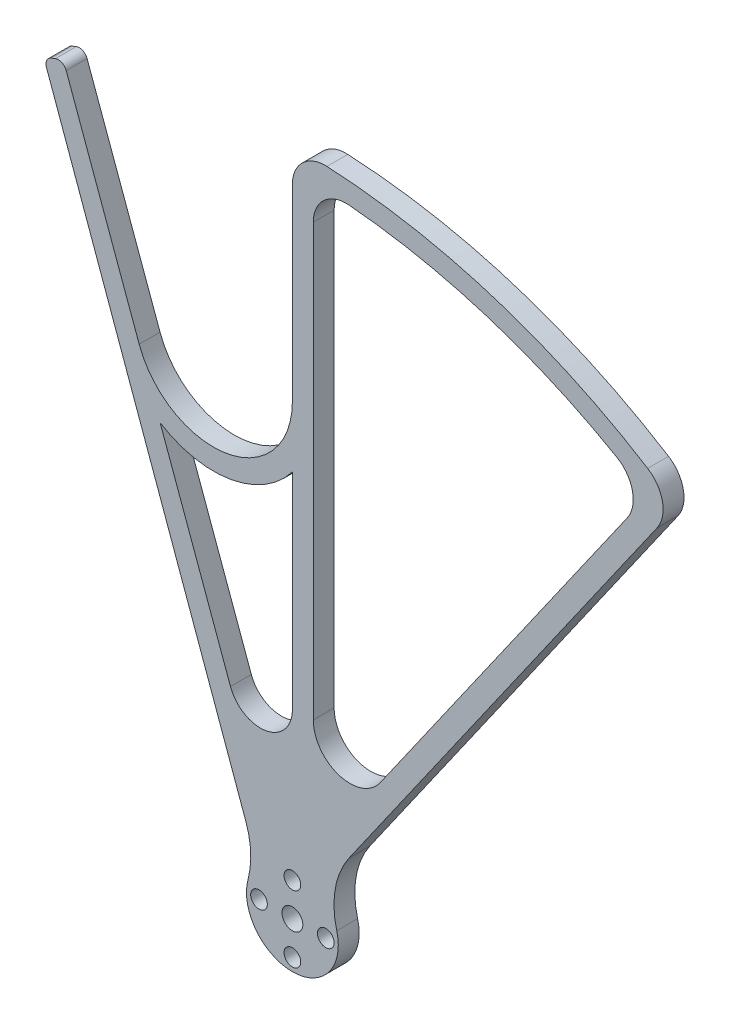
ISO-10303-21;
HEADER;
FILE_DESCRIPTION(('STEP AP214'),'2;1');
FILE_NAME('part.step','',(''),(''),'','','');
FILE_SCHEMA(('AUTOMOTIVE_DESIGN { 1 0 10303 214 1 1 1 1 }'));
ENDSEC;
DATA;
#1=APPLICATION_CONTEXT('core data for automotive mechanical design processes');
#2=APPLICATION_PROTOCOL_DEFINITION('international standard','automotive_design',2000,#1);
#3=PRODUCT_CONTEXT('',#1,'mechanical');
#4=PRODUCT('Part','Part','',(#3));
#5=PRODUCT_RELATED_PRODUCT_CATEGORY('part','',(#4));
#6=PRODUCT_DEFINITION_FORMATION('','',#4);
#7=PRODUCT_DEFINITION_CONTEXT('part definition',#1,'design');
#8=PRODUCT_DEFINITION('design','',#6,#7);
#9=PRODUCT_DEFINITION_SHAPE('','',#8);
#10=(LENGTH_UNIT() NAMED_UNIT(*) SI_UNIT(.MILLI.,.METRE.));
#11=(NAMED_UNIT(*) PLANE_ANGLE_UNIT() SI_UNIT($,.RADIAN.));
#12=(NAMED_UNIT(*) SI_UNIT($,.STERADIAN.) SOLID_ANGLE_UNIT());
#13=UNCERTAINTY_MEASURE_WITH_UNIT(LENGTH_MEASURE(1.E-05),#10,'distance_accuracy_value','');
#14=(GEOMETRIC_REPRESENTATION_CONTEXT(3) GLOBAL_UNCERTAINTY_ASSIGNED_CONTEXT((#13)) GLOBAL_UNIT_ASSIGNED_CONTEXT((#10,
#11,#12)) REPRESENTATION_CONTEXT('',''));
#15=CARTESIAN_POINT('',(0.,0.,0.));
#16=DIRECTION('',(0.,0.,1.));
#17=DIRECTION('',(1.,0.,0.));
#18=AXIS2_PLACEMENT_3D('',#15,#16,#17);
#19=CARTESIAN_POINT('',(0.,0.,6.35));
#20=DIRECTION('',(0.,0.,1.));
#21=DIRECTION('',(1.,0.,0.));
#22=AXIS2_PLACEMENT_3D('',#19,#20,#21);
#23=PLANE('',#22);
#24=CARTESIAN_POINT('',(0.,10.16,6.35));
#25=DIRECTION('',(0.,0.,1.));
#26=DIRECTION('',(1.,0.,0.));
#27=AXIS2_PLACEMENT_3D('',#24,#25,#26);
#28=CIRCLE('',#27,2.54);
#29=CARTESIAN_POINT('',(2.54,10.16,6.35));
#30=VERTEX_POINT('',#29);
#31=EDGE_CURVE('E1002',#30,#30,#28,.T.);
#32=ORIENTED_EDGE('',*,*,#31,.F.);
#33=EDGE_LOOP('',(#32));
#34=FACE_BOUND('',#33,.T.);
#35=CARTESIAN_POINT('',(10.1600000000003,2.86898206091004E-13,6.35));
#36=DIRECTION('',(0.,0.,1.));
#37=DIRECTION('',(1.,0.,0.));
#38=AXIS2_PLACEMENT_3D('',#35,#36,#37);
#39=CIRCLE('',#38,2.54000000000023);
#40=CARTESIAN_POINT('',(12.7000000000005,2.86898206091004E-13,6.35));
#41=VERTEX_POINT('',#40);
#42=EDGE_CURVE('E1025',#41,#41,#39,.T.);
#43=ORIENTED_EDGE('',*,*,#42,.F.);
#44=EDGE_LOOP('',(#43));
#45=FACE_BOUND('',#44,.T.);
#46=CARTESIAN_POINT('',(5.73796412182008E-13,-10.16,6.35));
#47=DIRECTION('',(0.,0.,1.));
#48=DIRECTION('',(1.,0.,0.));
#49=AXIS2_PLACEMENT_3D('',#46,#47,#48);
#50=CIRCLE('',#49,2.54000000000062);
#51=CARTESIAN_POINT('',(2.54000000000119,-10.16,6.35));
#52=VERTEX_POINT('',#51);
#53=EDGE_CURVE('E1017',#52,#52,#50,.T.);
#54=ORIENTED_EDGE('',*,*,#53,.F.);
#55=EDGE_LOOP('',(#54));
#56=FACE_BOUND('',#55,.T.);
#57=CARTESIAN_POINT('',(-10.1599999999997,-2.88142447238938E-13,6.35));
#58=DIRECTION('',(0.,0.,1.));
#59=DIRECTION('',(1.,0.,0.));
#60=AXIS2_PLACEMENT_3D('',#57,#58,#59);
#61=CIRCLE('',#60,2.54000000000046);
#62=CARTESIAN_POINT('',(-7.61999999999925,-2.88142447238938E-13,6.35));
#63=VERTEX_POINT('',#62);
#64=EDGE_CURVE('E1009',#63,#63,#61,.T.);
#65=ORIENTED_EDGE('',*,*,#64,.F.);
#66=EDGE_LOOP('',(#65));
#67=FACE_BOUND('',#66,.T.);
#68=CARTESIAN_POINT('',(-9.71604686105834,55.1024399216737,6.35));
#69=DIRECTION('',(0.,0.,1.));
#70=DIRECTION('',(1.,0.,0.));
#71=AXIS2_PLACEMENT_3D('',#68,#69,#70);
#72=CIRCLE('',#71,9.71604686105832);
#73=CARTESIAN_POINT('',(-18.8461443996049,51.7793561816956,6.35));
#74=VERTEX_POINT('',#73);
#75=CARTESIAN_POINT('',(0.,55.1024399216737,6.35));
#76=VERTEX_POINT('',#75);
#77=EDGE_CURVE('E316',#74,#76,#72,.T.);
#78=ORIENTED_EDGE('',*,*,#77,.F.);
#79=DIRECTION('',(0.34202014332567,-0.939692620785908,0.));
#80=VECTOR('',#79,1.);
#81=CARTESIAN_POINT('',(0.,0.,6.35));
#82=LINE('',#81,#80);
#83=CARTESIAN_POINT('',(-40.2695375819558,110.639645198303,6.35));
#84=VERTEX_POINT('',#83);
#85=EDGE_CURVE('E304',#84,#74,#82,.T.);
#86=ORIENTED_EDGE('',*,*,#85,.F.);
#87=CARTESIAN_POINT('',(-24.0388323197738,136.330992699971,6.35));
#88=DIRECTION('',(0.,0.,1.));
#89=DIRECTION('',(1.,0.,0.));
#90=AXIS2_PLACEMENT_3D('',#87,#88,#89);
#91=CIRCLE('',#90,30.3888323197738);
#92=CARTESIAN_POINT('',(0.,117.740251174655,6.35));
#93=VERTEX_POINT('',#92);
#94=EDGE_CURVE('E335',#84,#93,#91,.T.);
#95=ORIENTED_EDGE('',*,*,#94,.T.);
#96=DIRECTION('',(0.,1.,0.));
#97=VECTOR('',#96,1.);
#98=CARTESIAN_POINT('',(0.,0.,6.35));
#99=LINE('',#98,#97);
#100=EDGE_CURVE('E331',#76,#93,#99,.T.);
#101=ORIENTED_EDGE('',*,*,#100,.F.);
#102=EDGE_LOOP('',(#78,#86,#95,#101));
#103=FACE_BOUND('',#102,.T.);
#104=DIRECTION('',(-0.34202014332567,0.939692620785908,0.));
#105=VECTOR('',#104,1.);
#106=CARTESIAN_POINT('',(-46.627945662975,128.109227824581,6.35));
#107=LINE('',#106,#105);
#108=CARTESIAN_POINT('',(-46.627945662975,128.109227824581,6.35));
#109=VERTEX_POINT('',#108);
#110=CARTESIAN_POINT('',(-68.8359192444153,189.125133771432,6.35));
#111=VERTEX_POINT('',#110);
#112=EDGE_CURVE('E399',#109,#111,#107,.T.);
#113=ORIENTED_EDGE('',*,*,#112,.T.);
#114=CARTESIAN_POINT('',(-71.2227385012115,188.256402607385,6.35));
#115=DIRECTION('',(0.,0.,1.));
#116=DIRECTION('',(1.,0.,0.));
#117=AXIS2_PLACEMENT_3D('',#114,#115,#116);
#118=CIRCLE('',#117,2.54);
#119=CARTESIAN_POINT('',(-72.1215205096228,190.632069019438,6.35));
#120=VERTEX_POINT('',#119);
#121=EDGE_CURVE('E537',#111,#120,#118,.T.);
#122=ORIENTED_EDGE('',*,*,#121,.T.);
#123=CARTESIAN_POINT('',(0.,0.,6.35));
#124=DIRECTION('',(0.,0.,1.));
#125=DIRECTION('',(1.,0.,0.));
#126=AXIS2_PLACEMENT_3D('',#123,#124,#125);
#127=CIRCLE('',#126,203.818790741314);
#128=CARTESIAN_POINT('',(-73.3590902899023,190.15925781063,6.35));
#129=VERTEX_POINT('',#128);
#130=EDGE_CURVE('E403',#120,#129,#127,.T.);
#131=ORIENTED_EDGE('',*,*,#130,.T.);
#132=CARTESIAN_POINT('',(-72.4448856247748,187.789483595592,6.35));
#133=DIRECTION('',(0.,0.,1.));
#134=DIRECTION('',(1.,0.,0.));
#135=AXIS2_PLACEMENT_3D('',#132,#133,#134);
#136=CIRCLE('',#135,2.54);
#137=CARTESIAN_POINT('',(-74.8344424752258,186.928311105052,6.35));
#138=VERTEX_POINT('',#137);
#139=EDGE_CURVE('E534',#129,#138,#136,.T.);
#140=ORIENTED_EDGE('',*,*,#139,.T.);
#141=DIRECTION('',(0.339044287614181,-0.940770413563369,0.));
#142=VECTOR('',#141,1.);
#143=CARTESIAN_POINT('',(-75.6714998267329,189.250953955917,6.35));
#144=LINE('',#143,#142);
#145=CARTESIAN_POINT('',(-14.1628084371073,18.5783924343719,6.35));
#146=VERTEX_POINT('',#145);
#147=EDGE_CURVE('E408',#138,#146,#144,.T.);
#148=ORIENTED_EDGE('',*,*,#147,.T.);
#149=CARTESIAN_POINT('',(-37.9078536754467,10.02091461499,6.35));
#150=DIRECTION('',(0.,0.,1.));
#151=DIRECTION('',(1.,0.,0.));
#152=AXIS2_PLACEMENT_3D('',#149,#150,#151);
#153=CIRCLE('',#152,25.24);
#154=CARTESIAN_POINT('',(-13.5060626331546,3.57031821401198,6.35));
#155=VERTEX_POINT('',#154);
#156=EDGE_CURVE('E12',#146,#155,#153,.F.);
#157=ORIENTED_EDGE('',*,*,#156,.T.);
#158=CARTESIAN_POINT('',(0.,0.,6.35));
#159=DIRECTION('',(0.,0.,1.));
#160=DIRECTION('',(1.,0.,0.));
#161=AXIS2_PLACEMENT_3D('',#158,#159,#160);
#162=CIRCLE('',#161,13.97);
#163=CARTESIAN_POINT('',(13.4983455539887,3.59938429528074,6.35));
#164=VERTEX_POINT('',#163);
#165=EDGE_CURVE('E411',#155,#164,#162,.T.);
#166=ORIENTED_EDGE('',*,*,#165,.T.);
#167=CARTESIAN_POINT('',(37.886193927838,10.1024952196104,6.35));
#168=DIRECTION('',(0.,0.,1.));
#169=DIRECTION('',(1.,0.,0.));
#170=AXIS2_PLACEMENT_3D('',#167,#168,#169);
#171=CIRCLE('',#170,25.24);
#172=CARTESIAN_POINT('',(17.2107963299839,24.5795644731109,6.35));
#173=VERTEX_POINT('',#172);
#174=EDGE_CURVE('E560',#164,#173,#171,.F.);
#175=ORIENTED_EDGE('',*,*,#174,.T.);
#176=DIRECTION('',(0.573576436351047,0.819152044288991,0.));
#177=VECTOR('',#176,1.);
#178=CARTESIAN_POINT('',(8.01286281582413,11.4435540587172,6.35));
#179=LINE('',#178,#177);
#180=CARTESIAN_POINT('',(111.021825497871,158.555598789654,6.35));
#181=VERTEX_POINT('',#180);
#182=EDGE_CURVE('E415',#173,#181,#179,.T.);
#183=ORIENTED_EDGE('',*,*,#182,.T.);
#184=CARTESIAN_POINT('',(102.830305054981,164.291363153165,6.35));
#185=DIRECTION('',(0.,0.,1.));
#186=DIRECTION('',(1.,0.,0.));
#187=AXIS2_PLACEMENT_3D('',#184,#185,#186);
#188=CIRCLE('',#187,10.);
#189=CARTESIAN_POINT('',(108.135791930721,172.767907791834,6.35));
#190=VERTEX_POINT('',#189);
#191=EDGE_CURVE('E499',#181,#190,#188,.T.);
#192=ORIENTED_EDGE('',*,*,#191,.T.);
#193=CARTESIAN_POINT('',(0.,0.,6.35));
#194=DIRECTION('',(0.,0.,1.));
#195=DIRECTION('',(1.,0.,0.));
#196=AXIS2_PLACEMENT_3D('',#193,#194,#195);
#197=CIRCLE('',#196,203.818790741314);
#198=CARTESIAN_POINT('',(10.5159458462078,203.547327032834,6.35));
#199=VERTEX_POINT('',#198);
#200=EDGE_CURVE('E418',#190,#199,#197,.T.);
#201=ORIENTED_EDGE('',*,*,#200,.T.);
#202=CARTESIAN_POINT('',(10.,193.560645908267,6.35));
#203=DIRECTION('',(0.,0.,1.));
#204=DIRECTION('',(1.,0.,0.));
#205=AXIS2_PLACEMENT_3D('',#202,#203,#204);
#206=CIRCLE('',#205,10.);
#207=CARTESIAN_POINT('',(0.,193.560645908267,6.35));
#208=VERTEX_POINT('',#207);
#209=EDGE_CURVE('E496',#199,#208,#206,.T.);
#210=ORIENTED_EDGE('',*,*,#209,.T.);
#211=DIRECTION('',(0.,1.,0.));
#212=VECTOR('',#211,1.);
#213=CARTESIAN_POINT('',(0.,136.330992699971,6.35));
#214=LINE('',#213,#212);
#215=CARTESIAN_POINT('',(0.,136.330992699971,6.35));
#216=VERTEX_POINT('',#215);
#217=EDGE_CURVE('E422',#216,#208,#214,.T.);
#218=ORIENTED_EDGE('',*,*,#217,.F.);
#219=CARTESIAN_POINT('',(-24.0388323197738,136.330992699971,6.35));
#220=DIRECTION('',(0.,0.,1.));
#221=DIRECTION('',(1.,0.,0.));
#222=AXIS2_PLACEMENT_3D('',#219,#220,#221);
#223=CIRCLE('',#222,24.0388323197738);
#224=EDGE_CURVE('E426',#109,#216,#223,.T.);
#225=ORIENTED_EDGE('',*,*,#224,.F.);
#226=EDGE_LOOP('',(#113,#122,#131,#140,#148,#157,#166,#175,#183,#192,#201,#210,#218,#225));
#227=FACE_BOUND('',#226,.T.);
#228=CARTESIAN_POINT('',(17.526,55.5853705062175,6.35));
#229=DIRECTION('',(0.,0.,1.));
#230=DIRECTION('',(1.,0.,0.));
#231=AXIS2_PLACEMENT_3D('',#228,#229,#230);
#232=CIRCLE('',#231,11.176);
#233=CARTESIAN_POINT('',(26.680843246974,49.1750802535586,6.35));
#234=VERTEX_POINT('',#233);
#235=CARTESIAN_POINT('',(6.35,55.5853705062179,6.35));
#236=VERTEX_POINT('',#235);
#237=EDGE_CURVE('E361',#234,#236,#232,.F.);
#238=ORIENTED_EDGE('',*,*,#237,.T.);
#239=DIRECTION('',(0.,1.,0.));
#240=VECTOR('',#239,1.);
#241=CARTESIAN_POINT('',(6.35,0.,6.35));
#242=LINE('',#241,#240);
#243=CARTESIAN_POINT('',(6.35,186.754451090224,6.35));
#244=VERTEX_POINT('',#243);
#245=EDGE_CURVE('E374',#236,#244,#242,.T.);
#246=ORIENTED_EDGE('',*,*,#245,.T.);
#247=CARTESIAN_POINT('',(16.35,186.754451090224,6.35));
#248=DIRECTION('',(0.,0.,1.));
#249=DIRECTION('',(1.,0.,0.));
#250=AXIS2_PLACEMENT_3D('',#247,#248,#249);
#251=CIRCLE('',#250,10.);
#252=CARTESIAN_POINT('',(17.2221451680222,196.716346633036,6.35));
#253=VERTEX_POINT('',#252);
#254=EDGE_CURVE('E515',#244,#253,#251,.F.);
#255=ORIENTED_EDGE('',*,*,#254,.T.);
#256=CARTESIAN_POINT('',(0.,0.,6.35));
#257=DIRECTION('',(0.,0.,1.));
#258=DIRECTION('',(1.,0.,0.));
#259=AXIS2_PLACEMENT_3D('',#256,#257,#258);
#260=CIRCLE('',#259,197.468790741315);
#261=CARTESIAN_POINT('',(98.7243056523468,171.018814141307,6.35));
#262=VERTEX_POINT('',#261);
#263=EDGE_CURVE('E370',#262,#253,#260,.T.);
#264=ORIENTED_EDGE('',*,*,#263,.F.);
#265=CARTESIAN_POINT('',(93.7248166049015,162.358265124965,6.35));
#266=DIRECTION('',(0.,0.,1.));
#267=DIRECTION('',(1.,0.,0.));
#268=AXIS2_PLACEMENT_3D('',#265,#266,#267);
#269=CIRCLE('',#268,10.);
#270=CARTESIAN_POINT('',(101.916337047791,156.622500761454,6.35));
#271=VERTEX_POINT('',#270);
#272=EDGE_CURVE('E509',#262,#271,#269,.F.);
#273=ORIENTED_EDGE('',*,*,#272,.T.);
#274=DIRECTION('',(0.573576436351047,0.819152044288991,0.));
#275=VECTOR('',#274,1.);
#276=CARTESIAN_POINT('',(-5.20161548123508,3.64221037082914,6.35));
#277=LINE('',#276,#275);
#278=EDGE_CURVE('E365',#234,#271,#277,.T.);
#279=ORIENTED_EDGE('',*,*,#278,.F.);
#280=EDGE_LOOP('',(#238,#246,#255,#264,#273,#279));
#281=FACE_BOUND('',#280,.T.);
#282=CARTESIAN_POINT('',(0.,0.,6.35));
#283=DIRECTION('',(0.,0.,1.));
#284=DIRECTION('',(1.,0.,0.));
#285=AXIS2_PLACEMENT_3D('',#282,#283,#284);
#286=CIRCLE('',#285,3.175);
#287=CARTESIAN_POINT('',(3.175,0.,6.35));
#288=VERTEX_POINT('',#287);
#289=EDGE_CURVE('E344',#288,#288,#286,.T.);
#290=ORIENTED_EDGE('',*,*,#289,.F.);
#291=EDGE_LOOP('',(#290));
#292=FACE_BOUND('',#291,.T.);
#293=ADVANCED_FACE('F142',(#34,#45,#56,#67,#103,#227,#281,#292),#23,.T.);
#294=CARTESIAN_POINT('',(0.,0.,0.));
#295=DIRECTION('',(0.,0.,1.));
#296=DIRECTION('',(1.,0.,0.));
#297=AXIS2_PLACEMENT_3D('',#294,#295,#296);
#298=PLANE('',#297);
#299=CARTESIAN_POINT('',(0.,10.16,0.));
#300=DIRECTION('',(0.,0.,1.));
#301=DIRECTION('',(1.,0.,0.));
#302=AXIS2_PLACEMENT_3D('',#299,#300,#301);
#303=CIRCLE('',#302,2.54);
#304=CARTESIAN_POINT('',(2.54,10.16,0.));
#305=VERTEX_POINT('',#304);
#306=EDGE_CURVE('E996',#305,#305,#303,.T.);
#307=ORIENTED_EDGE('',*,*,#306,.T.);
#308=EDGE_LOOP('',(#307));
#309=FACE_BOUND('',#308,.T.);
#310=CARTESIAN_POINT('',(10.1600000000003,2.86898206091004E-13,0.));
#311=DIRECTION('',(0.,0.,1.));
#312=DIRECTION('',(1.,0.,0.));
#313=AXIS2_PLACEMENT_3D('',#310,#311,#312);
#314=CIRCLE('',#313,2.54000000000023);
#315=CARTESIAN_POINT('',(12.7000000000005,2.86898206091004E-13,0.));
#316=VERTEX_POINT('',#315);
#317=EDGE_CURVE('E1021',#316,#316,#314,.T.);
#318=ORIENTED_EDGE('',*,*,#317,.T.);
#319=EDGE_LOOP('',(#318));
#320=FACE_BOUND('',#319,.T.);
#321=CARTESIAN_POINT('',(5.73796412182008E-13,-10.16,0.));
#322=DIRECTION('',(0.,0.,1.));
#323=DIRECTION('',(1.,0.,0.));
#324=AXIS2_PLACEMENT_3D('',#321,#322,#323);
#325=CIRCLE('',#324,2.54000000000062);
#326=CARTESIAN_POINT('',(2.54000000000119,-10.16,0.));
#327=VERTEX_POINT('',#326);
#328=EDGE_CURVE('E1013',#327,#327,#325,.T.);
#329=ORIENTED_EDGE('',*,*,#328,.T.);
#330=EDGE_LOOP('',(#329));
#331=FACE_BOUND('',#330,.T.);
#332=CARTESIAN_POINT('',(-10.1599999999997,-2.88142447238938E-13,0.));
#333=DIRECTION('',(0.,0.,1.));
#334=DIRECTION('',(1.,0.,0.));
#335=AXIS2_PLACEMENT_3D('',#332,#333,#334);
#336=CIRCLE('',#335,2.54000000000046);
#337=CARTESIAN_POINT('',(-7.61999999999925,-2.88142447238938E-13,0.));
#338=VERTEX_POINT('',#337);
#339=EDGE_CURVE('E1005',#338,#338,#336,.T.);
#340=ORIENTED_EDGE('',*,*,#339,.T.);
#341=EDGE_LOOP('',(#340));
#342=FACE_BOUND('',#341,.T.);
#343=CARTESIAN_POINT('',(0.,0.,0.));
#344=DIRECTION('',(0.,0.,1.));
#345=DIRECTION('',(1.,0.,0.));
#346=AXIS2_PLACEMENT_3D('',#343,#344,#345);
#347=CIRCLE('',#346,203.818790741314);
#348=CARTESIAN_POINT('',(-72.1215205096228,190.632069019438,0.));
#349=VERTEX_POINT('',#348);
#350=CARTESIAN_POINT('',(-73.3590902899023,190.15925781063,0.));
#351=VERTEX_POINT('',#350);
#352=EDGE_CURVE('E434',#349,#351,#347,.T.);
#353=ORIENTED_EDGE('',*,*,#352,.F.);
#354=CARTESIAN_POINT('',(-71.2227385012115,188.256402607385,0.));
#355=DIRECTION('',(0.,0.,1.));
#356=DIRECTION('',(1.,0.,0.));
#357=AXIS2_PLACEMENT_3D('',#354,#355,#356);
#358=CIRCLE('',#357,2.54);
#359=CARTESIAN_POINT('',(-68.8359192444153,189.125133771432,0.));
#360=VERTEX_POINT('',#359);
#361=EDGE_CURVE('E528',#349,#360,#358,.F.);
#362=ORIENTED_EDGE('',*,*,#361,.T.);
#363=DIRECTION('',(-0.34202014332567,0.939692620785908,0.));
#364=VECTOR('',#363,1.);
#365=CARTESIAN_POINT('',(-46.627945662975,128.109227824581,0.));
#366=LINE('',#365,#364);
#367=CARTESIAN_POINT('',(-46.627945662975,128.109227824581,0.));
#368=VERTEX_POINT('',#367);
#369=EDGE_CURVE('E398',#368,#360,#366,.T.);
#370=ORIENTED_EDGE('',*,*,#369,.F.);
#371=CARTESIAN_POINT('',(-24.0388323197738,136.330992699971,0.));
#372=DIRECTION('',(0.,0.,1.));
#373=DIRECTION('',(1.,0.,0.));
#374=AXIS2_PLACEMENT_3D('',#371,#372,#373);
#375=CIRCLE('',#374,24.0388323197738);
#376=CARTESIAN_POINT('',(0.,136.330992699971,0.));
#377=VERTEX_POINT('',#376);
#378=EDGE_CURVE('E404',#368,#377,#375,.T.);
#379=ORIENTED_EDGE('',*,*,#378,.T.);
#380=DIRECTION('',(0.,1.,0.));
#381=VECTOR('',#380,1.);
#382=CARTESIAN_POINT('',(0.,136.330992699971,0.));
#383=LINE('',#382,#381);
#384=CARTESIAN_POINT('',(0.,193.560645908267,0.));
#385=VERTEX_POINT('',#384);
#386=EDGE_CURVE('E452',#377,#385,#383,.T.);
#387=ORIENTED_EDGE('',*,*,#386,.T.);
#388=CARTESIAN_POINT('',(10.,193.560645908267,0.));
#389=DIRECTION('',(0.,0.,1.));
#390=DIRECTION('',(1.,0.,0.));
#391=AXIS2_PLACEMENT_3D('',#388,#389,#390);
#392=CIRCLE('',#391,10.);
#393=CARTESIAN_POINT('',(10.5159458462078,203.547327032834,0.));
#394=VERTEX_POINT('',#393);
#395=EDGE_CURVE('E485',#385,#394,#392,.F.);
#396=ORIENTED_EDGE('',*,*,#395,.T.);
#397=CARTESIAN_POINT('',(0.,0.,0.));
#398=DIRECTION('',(0.,0.,1.));
#399=DIRECTION('',(1.,0.,0.));
#400=AXIS2_PLACEMENT_3D('',#397,#398,#399);
#401=CIRCLE('',#400,203.818790741314);
#402=CARTESIAN_POINT('',(108.135791930721,172.767907791834,0.));
#403=VERTEX_POINT('',#402);
#404=EDGE_CURVE('E448',#403,#394,#401,.T.);
#405=ORIENTED_EDGE('',*,*,#404,.F.);
#406=CARTESIAN_POINT('',(102.830305054981,164.291363153165,0.));
#407=DIRECTION('',(0.,0.,1.));
#408=DIRECTION('',(1.,0.,0.));
#409=AXIS2_PLACEMENT_3D('',#406,#407,#408);
#410=CIRCLE('',#409,10.);
#411=CARTESIAN_POINT('',(111.021825497871,158.555598789654,0.));
#412=VERTEX_POINT('',#411);
#413=EDGE_CURVE('E488',#403,#412,#410,.F.);
#414=ORIENTED_EDGE('',*,*,#413,.T.);
#415=DIRECTION('',(0.573576436351047,0.819152044288991,0.));
#416=VECTOR('',#415,1.);
#417=CARTESIAN_POINT('',(8.01286281582413,11.4435540587172,0.));
#418=LINE('',#417,#416);
#419=CARTESIAN_POINT('',(17.2107963299839,24.5795644731109,0.));
#420=VERTEX_POINT('',#419);
#421=EDGE_CURVE('E445',#420,#412,#418,.T.);
#422=ORIENTED_EDGE('',*,*,#421,.F.);
#423=CARTESIAN_POINT('',(37.886193927838,10.1024952196104,0.));
#424=DIRECTION('',(0.,0.,1.));
#425=DIRECTION('',(1.,0.,0.));
#426=AXIS2_PLACEMENT_3D('',#423,#424,#425);
#427=CIRCLE('',#426,25.24);
#428=CARTESIAN_POINT('',(13.4983455539887,3.59938429528074,0.));
#429=VERTEX_POINT('',#428);
#430=EDGE_CURVE('E557',#420,#429,#427,.T.);
#431=ORIENTED_EDGE('',*,*,#430,.T.);
#432=CARTESIAN_POINT('',(0.,0.,0.));
#433=DIRECTION('',(0.,0.,1.));
#434=DIRECTION('',(1.,0.,0.));
#435=AXIS2_PLACEMENT_3D('',#432,#433,#434);
#436=CIRCLE('',#435,13.97);
#437=CARTESIAN_POINT('',(-13.5060626331546,3.57031821401198,0.));
#438=VERTEX_POINT('',#437);
#439=EDGE_CURVE('E441',#438,#429,#436,.T.);
#440=ORIENTED_EDGE('',*,*,#439,.F.);
#441=CARTESIAN_POINT('',(-37.9078536754467,10.02091461499,0.));
#442=DIRECTION('',(0.,0.,1.));
#443=DIRECTION('',(1.,0.,0.));
#444=AXIS2_PLACEMENT_3D('',#441,#442,#443);
#445=CIRCLE('',#444,25.24);
#446=CARTESIAN_POINT('',(-14.1628084371073,18.5783924343719,0.));
#447=VERTEX_POINT('',#446);
#448=EDGE_CURVE('E151',#438,#447,#445,.T.);
#449=ORIENTED_EDGE('',*,*,#448,.T.);
#450=DIRECTION('',(0.339044287614181,-0.940770413563369,0.));
#451=VECTOR('',#450,1.);
#452=CARTESIAN_POINT('',(-75.6714998267329,189.250953955917,0.));
#453=LINE('',#452,#451);
#454=CARTESIAN_POINT('',(-74.8344424752258,186.928311105052,0.));
#455=VERTEX_POINT('',#454);
#456=EDGE_CURVE('E438',#455,#447,#453,.T.);
#457=ORIENTED_EDGE('',*,*,#456,.F.);
#458=CARTESIAN_POINT('',(-72.4448856247748,187.789483595592,0.));
#459=DIRECTION('',(0.,0.,1.));
#460=DIRECTION('',(1.,0.,0.));
#461=AXIS2_PLACEMENT_3D('',#458,#459,#460);
#462=CIRCLE('',#461,2.54);
#463=EDGE_CURVE('E525',#455,#351,#462,.F.);
#464=ORIENTED_EDGE('',*,*,#463,.T.);
#465=EDGE_LOOP('',(#353,#362,#370,#379,#387,#396,#405,#414,#422,#431,#440,#449,#457,#464));
#466=FACE_BOUND('',#465,.T.);
#467=DIRECTION('',(0.,1.,0.));
#468=VECTOR('',#467,1.);
#469=CARTESIAN_POINT('',(6.35,0.,0.));
#470=LINE('',#469,#468);
#471=CARTESIAN_POINT('',(6.35,55.5853705062179,0.));
#472=VERTEX_POINT('',#471);
#473=CARTESIAN_POINT('',(6.35,186.754451090224,0.));
#474=VERTEX_POINT('',#473);
#475=EDGE_CURVE('E366',#472,#474,#470,.T.);
#476=ORIENTED_EDGE('',*,*,#475,.F.);
#477=CARTESIAN_POINT('',(17.526,55.5853705062175,0.));
#478=DIRECTION('',(0.,0.,1.));
#479=DIRECTION('',(1.,0.,0.));
#480=AXIS2_PLACEMENT_3D('',#477,#478,#479);
#481=CIRCLE('',#480,11.176);
#482=CARTESIAN_POINT('',(26.680843246974,49.1750802535586,0.));
#483=VERTEX_POINT('',#482);
#484=EDGE_CURVE('E325',#483,#472,#481,.F.);
#485=ORIENTED_EDGE('',*,*,#484,.F.);
#486=DIRECTION('',(0.573576436351047,0.819152044288991,0.));
#487=VECTOR('',#486,1.);
#488=CARTESIAN_POINT('',(-5.20161548123508,3.64221037082914,0.));
#489=LINE('',#488,#487);
#490=CARTESIAN_POINT('',(101.916337047791,156.622500761454,0.));
#491=VERTEX_POINT('',#490);
#492=EDGE_CURVE('E381',#483,#491,#489,.T.);
#493=ORIENTED_EDGE('',*,*,#492,.T.);
#494=CARTESIAN_POINT('',(93.7248166049015,162.358265124965,0.));
#495=DIRECTION('',(0.,0.,1.));
#496=DIRECTION('',(1.,0.,0.));
#497=AXIS2_PLACEMENT_3D('',#494,#495,#496);
#498=CIRCLE('',#497,10.);
#499=CARTESIAN_POINT('',(98.7243056523468,171.018814141307,0.));
#500=VERTEX_POINT('',#499);
#501=EDGE_CURVE('E506',#491,#500,#498,.T.);
#502=ORIENTED_EDGE('',*,*,#501,.T.);
#503=CARTESIAN_POINT('',(0.,0.,0.));
#504=DIRECTION('',(0.,0.,1.));
#505=DIRECTION('',(1.,0.,0.));
#506=AXIS2_PLACEMENT_3D('',#503,#504,#505);
#507=CIRCLE('',#506,197.468790741315);
#508=CARTESIAN_POINT('',(17.2221451680222,196.716346633036,0.));
#509=VERTEX_POINT('',#508);
#510=EDGE_CURVE('E385',#500,#509,#507,.T.);
#511=ORIENTED_EDGE('',*,*,#510,.T.);
#512=CARTESIAN_POINT('',(16.35,186.754451090224,0.));
#513=DIRECTION('',(0.,0.,1.));
#514=DIRECTION('',(1.,0.,0.));
#515=AXIS2_PLACEMENT_3D('',#512,#513,#514);
#516=CIRCLE('',#515,10.);
#517=EDGE_CURVE('E512',#509,#474,#516,.T.);
#518=ORIENTED_EDGE('',*,*,#517,.T.);
#519=EDGE_LOOP('',(#476,#485,#493,#502,#511,#518));
#520=FACE_BOUND('',#519,.T.);
#521=DIRECTION('',(0.34202014332567,-0.939692620785908,0.));
#522=VECTOR('',#521,1.);
#523=CARTESIAN_POINT('',(0.,0.,0.));
#524=LINE('',#523,#522);
#525=CARTESIAN_POINT('',(-40.2695375819558,110.639645198303,0.));
#526=VERTEX_POINT('',#525);
#527=CARTESIAN_POINT('',(-18.8461443996049,51.7793561816956,0.));
#528=VERTEX_POINT('',#527);
#529=EDGE_CURVE('E341',#526,#528,#524,.T.);
#530=ORIENTED_EDGE('',*,*,#529,.T.);
#531=CARTESIAN_POINT('',(-9.71604686105834,55.1024399216737,0.));
#532=DIRECTION('',(0.,0.,1.));
#533=DIRECTION('',(1.,0.,0.));
#534=AXIS2_PLACEMENT_3D('',#531,#532,#533);
#535=CIRCLE('',#534,9.71604686105832);
#536=CARTESIAN_POINT('',(0.,55.1024399216737,0.));
#537=VERTEX_POINT('',#536);
#538=EDGE_CURVE('E323',#528,#537,#535,.T.);
#539=ORIENTED_EDGE('',*,*,#538,.T.);
#540=DIRECTION('',(0.,1.,0.));
#541=VECTOR('',#540,1.);
#542=CARTESIAN_POINT('',(0.,0.,0.));
#543=LINE('',#542,#541);
#544=CARTESIAN_POINT('',(0.,117.740251174655,0.));
#545=VERTEX_POINT('',#544);
#546=EDGE_CURVE('E347',#537,#545,#543,.T.);
#547=ORIENTED_EDGE('',*,*,#546,.T.);
#548=CARTESIAN_POINT('',(-24.0388323197738,136.330992699971,0.));
#549=DIRECTION('',(0.,0.,1.));
#550=DIRECTION('',(1.,0.,0.));
#551=AXIS2_PLACEMENT_3D('',#548,#549,#550);
#552=CIRCLE('',#551,30.3888323197738);
#553=EDGE_CURVE('E317',#526,#545,#552,.T.);
#554=ORIENTED_EDGE('',*,*,#553,.F.);
#555=EDGE_LOOP('',(#530,#539,#547,#554));
#556=FACE_BOUND('',#555,.T.);
#557=CARTESIAN_POINT('',(0.,0.,0.));
#558=DIRECTION('',(0.,0.,1.));
#559=DIRECTION('',(1.,0.,0.));
#560=AXIS2_PLACEMENT_3D('',#557,#558,#559);
#561=CIRCLE('',#560,3.175);
#562=CARTESIAN_POINT('',(3.175,0.,0.));
#563=VERTEX_POINT('',#562);
#564=EDGE_CURVE('E993',#563,#563,#561,.T.);
#565=ORIENTED_EDGE('',*,*,#564,.T.);
#566=EDGE_LOOP('',(#565));
#567=FACE_BOUND('',#566,.T.);
#568=ADVANCED_FACE('F577',(#309,#320,#331,#342,#466,#520,#556,#567),#298,.F.);
#569=CARTESIAN_POINT('',(-46.627945662975,128.109227824581,6.35));
#570=DIRECTION('',(-0.939692620785908,-0.34202014332567,0.));
#571=DIRECTION('',(0.34202014332567,-0.939692620785908,0.));
#572=AXIS2_PLACEMENT_3D('',#569,#570,#571);
#573=PLANE('',#572);
#574=ORIENTED_EDGE('',*,*,#369,.T.);
#575=DIRECTION('',(0.,0.,-1.));
#576=VECTOR('',#575,1.);
#577=CARTESIAN_POINT('',(-68.8359192444153,189.125133771432,6.35));
#578=LINE('',#577,#576);
#579=EDGE_CURVE('E531',#360,#111,#578,.F.);
#580=ORIENTED_EDGE('',*,*,#579,.T.);
#581=ORIENTED_EDGE('',*,*,#112,.F.);
#582=DIRECTION('',(0.,0.,-1.));
#583=VECTOR('',#582,1.);
#584=CARTESIAN_POINT('',(-46.627945662975,128.109227824581,6.35));
#585=LINE('',#584,#583);
#586=EDGE_CURVE('E430',#109,#368,#585,.T.);
#587=ORIENTED_EDGE('',*,*,#586,.T.);
#588=EDGE_LOOP('',(#574,#580,#581,#587));
#589=FACE_BOUND('',#588,.T.);
#590=ADVANCED_FACE('F601',(#589),#573,.F.);
#591=CARTESIAN_POINT('',(0.,0.,6.35));
#592=DIRECTION('',(0.,0.,-1.));
#593=DIRECTION('',(-1.,0.,0.));
#594=AXIS2_PLACEMENT_3D('',#591,#592,#593);
#595=CYLINDRICAL_SURFACE('',#594,203.818790741314);
#596=ORIENTED_EDGE('',*,*,#130,.F.);
#597=DIRECTION('',(0.,0.,-1.));
#598=VECTOR('',#597,1.);
#599=CARTESIAN_POINT('',(-72.1215205096228,190.632069019438,6.35));
#600=LINE('',#599,#598);
#601=EDGE_CURVE('E521',#120,#349,#600,.T.);
#602=ORIENTED_EDGE('',*,*,#601,.T.);
#603=ORIENTED_EDGE('',*,*,#352,.T.);
#604=DIRECTION('',(0.,0.,-1.));
#605=VECTOR('',#604,1.);
#606=CARTESIAN_POINT('',(-73.3590902899023,190.15925781063,6.35));
#607=LINE('',#606,#605);
#608=EDGE_CURVE('E518',#351,#129,#607,.F.);
#609=ORIENTED_EDGE('',*,*,#608,.T.);
#610=EDGE_LOOP('',(#596,#602,#603,#609));
#611=FACE_BOUND('',#610,.T.);
#612=ADVANCED_FACE('F592',(#611),#595,.T.);
#613=CARTESIAN_POINT('',(-75.6714998267329,189.250953955917,6.35));
#614=DIRECTION('',(0.940770413563369,0.339044287614181,0.));
#615=DIRECTION('',(-0.339044287614181,0.940770413563369,0.));
#616=AXIS2_PLACEMENT_3D('',#613,#614,#615);
#617=PLANE('',#616);
#618=ORIENTED_EDGE('',*,*,#456,.T.);
#619=DIRECTION('',(0.,0.,1.));
#620=VECTOR('',#619,1.);
#621=CARTESIAN_POINT('',(-14.1628084371073,18.5783924343719,6.35));
#622=LINE('',#621,#620);
#623=EDGE_CURVE('E164',#447,#146,#622,.T.);
#624=ORIENTED_EDGE('',*,*,#623,.T.);
#625=ORIENTED_EDGE('',*,*,#147,.F.);
#626=DIRECTION('',(0.,0.,-1.));
#627=VECTOR('',#626,1.);
#628=CARTESIAN_POINT('',(-74.8344424752258,186.928311105052,6.35));
#629=LINE('',#628,#627);
#630=EDGE_CURVE('E540',#138,#455,#629,.T.);
#631=ORIENTED_EDGE('',*,*,#630,.T.);
#632=EDGE_LOOP('',(#618,#624,#625,#631));
#633=FACE_BOUND('',#632,.T.);
#634=ADVANCED_FACE('F586',(#633),#617,.F.);
#635=CARTESIAN_POINT('',(0.,0.,6.35));
#636=DIRECTION('',(0.,0.,-1.));
#637=DIRECTION('',(-1.,0.,0.));
#638=AXIS2_PLACEMENT_3D('',#635,#636,#637);
#639=CYLINDRICAL_SURFACE('',#638,13.97);
#640=ORIENTED_EDGE('',*,*,#439,.T.);
#641=DIRECTION('',(0.,0.,-1.));
#642=VECTOR('',#641,1.);
#643=CARTESIAN_POINT('',(13.4983455539887,3.59938429528074,6.35));
#644=LINE('',#643,#642);
#645=EDGE_CURVE('E552',#429,#164,#644,.F.);
#646=ORIENTED_EDGE('',*,*,#645,.T.);
#647=ORIENTED_EDGE('',*,*,#165,.F.);
#648=DIRECTION('',(0.,0.,-1.));
#649=VECTOR('',#648,1.);
#650=CARTESIAN_POINT('',(-13.5060626331546,3.57031821401198,6.35));
#651=LINE('',#650,#649);
#652=EDGE_CURVE('E548',#155,#438,#651,.T.);
#653=ORIENTED_EDGE('',*,*,#652,.T.);
#654=EDGE_LOOP('',(#640,#646,#647,#653));
#655=FACE_BOUND('',#654,.T.);
#656=ADVANCED_FACE('F580',(#655),#639,.T.);
#657=CARTESIAN_POINT('',(8.01286281582413,11.4435540587172,6.35));
#658=DIRECTION('',(-0.819152044288991,0.573576436351047,0.));
#659=DIRECTION('',(-0.573576436351047,-0.819152044288991,0.));
#660=AXIS2_PLACEMENT_3D('',#657,#658,#659);
#661=PLANE('',#660);
#662=ORIENTED_EDGE('',*,*,#182,.F.);
#663=DIRECTION('',(0.,0.,1.));
#664=VECTOR('',#663,1.);
#665=CARTESIAN_POINT('',(17.2107963299839,24.5795644731109,0.));
#666=LINE('',#665,#664);
#667=EDGE_CURVE('E544',#173,#420,#666,.F.);
#668=ORIENTED_EDGE('',*,*,#667,.T.);
#669=ORIENTED_EDGE('',*,*,#421,.T.);
#670=DIRECTION('',(0.,0.,-1.));
#671=VECTOR('',#670,1.);
#672=CARTESIAN_POINT('',(111.021825497871,158.555598789654,6.35));
#673=LINE('',#672,#671);
#674=EDGE_CURVE('E492',#412,#181,#673,.F.);
#675=ORIENTED_EDGE('',*,*,#674,.T.);
#676=EDGE_LOOP('',(#662,#668,#669,#675));
#677=FACE_BOUND('',#676,.T.);
#678=ADVANCED_FACE('F571',(#677),#661,.F.);
#679=CARTESIAN_POINT('',(0.,0.,6.35));
#680=DIRECTION('',(0.,0.,-1.));
#681=DIRECTION('',(-1.,0.,0.));
#682=AXIS2_PLACEMENT_3D('',#679,#680,#681);
#683=CYLINDRICAL_SURFACE('',#682,203.818790741314);
#684=ORIENTED_EDGE('',*,*,#200,.F.);
#685=DIRECTION('',(0.,0.,-1.));
#686=VECTOR('',#685,1.);
#687=CARTESIAN_POINT('',(108.135791930721,172.767907791834,6.35));
#688=LINE('',#687,#686);
#689=EDGE_CURVE('E481',#190,#403,#688,.T.);
#690=ORIENTED_EDGE('',*,*,#689,.T.);
#691=ORIENTED_EDGE('',*,*,#404,.T.);
#692=DIRECTION('',(0.,0.,-1.));
#693=VECTOR('',#692,1.);
#694=CARTESIAN_POINT('',(10.5159458462078,203.547327032834,6.35));
#695=LINE('',#694,#693);
#696=EDGE_CURVE('E478',#394,#199,#695,.F.);
#697=ORIENTED_EDGE('',*,*,#696,.T.);
#698=EDGE_LOOP('',(#684,#690,#691,#697));
#699=FACE_BOUND('',#698,.T.);
#700=ADVANCED_FACE('F618',(#699),#683,.T.);
#701=CARTESIAN_POINT('',(0.,136.330992699971,6.35));
#702=DIRECTION('',(-1.,0.,0.));
#703=DIRECTION('',(0.,0.,1.));
#704=AXIS2_PLACEMENT_3D('',#701,#702,#703);
#705=PLANE('',#704);
#706=ORIENTED_EDGE('',*,*,#217,.T.);
#707=DIRECTION('',(0.,0.,1.));
#708=VECTOR('',#707,1.);
#709=CARTESIAN_POINT('',(0.,193.560645908267,0.));
#710=LINE('',#709,#708);
#711=EDGE_CURVE('E502',#208,#385,#710,.F.);
#712=ORIENTED_EDGE('',*,*,#711,.T.);
#713=ORIENTED_EDGE('',*,*,#386,.F.);
#714=DIRECTION('',(0.,0.,-1.));
#715=VECTOR('',#714,1.);
#716=CARTESIAN_POINT('',(0.,136.330992699971,6.35));
#717=LINE('',#716,#715);
#718=EDGE_CURVE('E461',#216,#377,#717,.T.);
#719=ORIENTED_EDGE('',*,*,#718,.F.);
#720=EDGE_LOOP('',(#706,#712,#713,#719));
#721=FACE_BOUND('',#720,.T.);
#722=ADVANCED_FACE('F609',(#721),#705,.T.);
#723=CARTESIAN_POINT('',(-24.0388323197738,136.330992699971,6.35));
#724=DIRECTION('',(0.,0.,-1.));
#725=DIRECTION('',(-1.,0.,0.));
#726=AXIS2_PLACEMENT_3D('',#723,#724,#725);
#727=CYLINDRICAL_SURFACE('',#726,24.0388323197738);
#728=ORIENTED_EDGE('',*,*,#378,.F.);
#729=ORIENTED_EDGE('',*,*,#586,.F.);
#730=ORIENTED_EDGE('',*,*,#224,.T.);
#731=ORIENTED_EDGE('',*,*,#718,.T.);
#732=EDGE_LOOP('',(#728,#729,#730,#731));
#733=FACE_BOUND('',#732,.T.);
#734=ADVANCED_FACE('F605',(#733),#727,.F.);
#735=CARTESIAN_POINT('',(17.526,55.5853705062175,6.35));
#736=DIRECTION('',(0.,0.,-1.));
#737=DIRECTION('',(-1.,0.,0.));
#738=AXIS2_PLACEMENT_3D('',#735,#736,#737);
#739=CYLINDRICAL_SURFACE('',#738,11.176);
#740=ORIENTED_EDGE('',*,*,#484,.T.);
#741=DIRECTION('',(0.,0.,-1.));
#742=VECTOR('',#741,1.);
#743=CARTESIAN_POINT('',(6.35,55.5853705062179,6.35));
#744=LINE('',#743,#742);
#745=EDGE_CURVE('E378',#236,#472,#744,.T.);
#746=ORIENTED_EDGE('',*,*,#745,.F.);
#747=ORIENTED_EDGE('',*,*,#237,.F.);
#748=DIRECTION('',(0.,0.,-1.));
#749=VECTOR('',#748,1.);
#750=CARTESIAN_POINT('',(26.680843246974,49.1750802535586,6.35));
#751=LINE('',#750,#749);
#752=EDGE_CURVE('E395',#234,#483,#751,.T.);
#753=ORIENTED_EDGE('',*,*,#752,.T.);
#754=EDGE_LOOP('',(#740,#746,#747,#753));
#755=FACE_BOUND('',#754,.T.);
#756=ADVANCED_FACE('F644',(#755),#739,.F.);
#757=CARTESIAN_POINT('',(-5.20161548123508,3.64221037082914,6.35));
#758=DIRECTION('',(-0.819152044288991,0.573576436351047,0.));
#759=DIRECTION('',(-0.573576436351047,-0.819152044288991,0.));
#760=AXIS2_PLACEMENT_3D('',#757,#758,#759);
#761=PLANE('',#760);
#762=ORIENTED_EDGE('',*,*,#278,.T.);
#763=DIRECTION('',(0.,0.,1.));
#764=VECTOR('',#763,1.);
#765=CARTESIAN_POINT('',(101.916337047791,156.622500761454,0.));
#766=LINE('',#765,#764);
#767=EDGE_CURVE('E464',#271,#491,#766,.F.);
#768=ORIENTED_EDGE('',*,*,#767,.T.);
#769=ORIENTED_EDGE('',*,*,#492,.F.);
#770=ORIENTED_EDGE('',*,*,#752,.F.);
#771=EDGE_LOOP('',(#762,#768,#769,#770));
#772=FACE_BOUND('',#771,.T.);
#773=ADVANCED_FACE('F679',(#772),#761,.T.);
#774=CARTESIAN_POINT('',(0.,0.,6.35));
#775=DIRECTION('',(0.,0.,-1.));
#776=DIRECTION('',(-1.,0.,0.));
#777=AXIS2_PLACEMENT_3D('',#774,#775,#776);
#778=CYLINDRICAL_SURFACE('',#777,197.468790741315);
#779=ORIENTED_EDGE('',*,*,#510,.F.);
#780=DIRECTION('',(0.,0.,-1.));
#781=VECTOR('',#780,1.);
#782=CARTESIAN_POINT('',(98.7243056523468,171.018814141308,6.35));
#783=LINE('',#782,#781);
#784=EDGE_CURVE('E472',#500,#262,#783,.F.);
#785=ORIENTED_EDGE('',*,*,#784,.T.);
#786=ORIENTED_EDGE('',*,*,#263,.T.);
#787=DIRECTION('',(0.,0.,-1.));
#788=VECTOR('',#787,1.);
#789=CARTESIAN_POINT('',(17.2221451680222,196.716346633036,6.35));
#790=LINE('',#789,#788);
#791=EDGE_CURVE('E468',#253,#509,#790,.T.);
#792=ORIENTED_EDGE('',*,*,#791,.T.);
#793=EDGE_LOOP('',(#779,#785,#786,#792));
#794=FACE_BOUND('',#793,.T.);
#795=ADVANCED_FACE('F691',(#794),#778,.F.);
#796=CARTESIAN_POINT('',(6.35,0.,6.35));
#797=DIRECTION('',(-1.,0.,0.));
#798=DIRECTION('',(0.,0.,1.));
#799=AXIS2_PLACEMENT_3D('',#796,#797,#798);
#800=PLANE('',#799);
#801=ORIENTED_EDGE('',*,*,#475,.T.);
#802=DIRECTION('',(0.,0.,-1.));
#803=VECTOR('',#802,1.);
#804=CARTESIAN_POINT('',(6.35,186.754451090224,6.35));
#805=LINE('',#804,#803);
#806=EDGE_CURVE('E475',#474,#244,#805,.F.);
#807=ORIENTED_EDGE('',*,*,#806,.T.);
#808=ORIENTED_EDGE('',*,*,#245,.F.);
#809=ORIENTED_EDGE('',*,*,#745,.T.);
#810=EDGE_LOOP('',(#801,#807,#808,#809));
#811=FACE_BOUND('',#810,.T.);
#812=ADVANCED_FACE('F694',(#811),#800,.F.);
#813=CARTESIAN_POINT('',(0.,0.,6.35));
#814=DIRECTION('',(0.939692620785908,0.34202014332567,0.));
#815=DIRECTION('',(-0.34202014332567,0.939692620785908,0.));
#816=AXIS2_PLACEMENT_3D('',#813,#814,#815);
#817=PLANE('',#816);
#818=ORIENTED_EDGE('',*,*,#529,.F.);
#819=DIRECTION('',(0.,0.,-1.));
#820=VECTOR('',#819,1.);
#821=CARTESIAN_POINT('',(-40.2695375819558,110.639645198303,6.35));
#822=LINE('',#821,#820);
#823=EDGE_CURVE('E310',#84,#526,#822,.T.);
#824=ORIENTED_EDGE('',*,*,#823,.F.);
#825=ORIENTED_EDGE('',*,*,#85,.T.);
#826=DIRECTION('',(0.,0.,-1.));
#827=VECTOR('',#826,1.);
#828=CARTESIAN_POINT('',(-18.8461443996049,51.7793561816956,6.35));
#829=LINE('',#828,#827);
#830=EDGE_CURVE('E307',#74,#528,#829,.T.);
#831=ORIENTED_EDGE('',*,*,#830,.T.);
#832=EDGE_LOOP('',(#818,#824,#825,#831));
#833=FACE_BOUND('',#832,.T.);
#834=ADVANCED_FACE('F306',(#833),#817,.T.);
#835=CARTESIAN_POINT('',(-9.71604686105834,55.1024399216737,6.35));
#836=DIRECTION('',(0.,0.,-1.));
#837=DIRECTION('',(-1.,0.,0.));
#838=AXIS2_PLACEMENT_3D('',#835,#836,#837);
#839=CYLINDRICAL_SURFACE('',#838,9.71604686105832);
#840=ORIENTED_EDGE('',*,*,#538,.F.);
#841=ORIENTED_EDGE('',*,*,#830,.F.);
#842=ORIENTED_EDGE('',*,*,#77,.T.);
#843=DIRECTION('',(0.,0.,-1.));
#844=VECTOR('',#843,1.);
#845=CARTESIAN_POINT('',(0.,55.1024399216737,6.35));
#846=LINE('',#845,#844);
#847=EDGE_CURVE('E326',#76,#537,#846,.T.);
#848=ORIENTED_EDGE('',*,*,#847,.T.);
#849=EDGE_LOOP('',(#840,#841,#842,#848));
#850=FACE_BOUND('',#849,.T.);
#851=ADVANCED_FACE('F320',(#850),#839,.F.);
#852=CARTESIAN_POINT('',(0.,0.,6.35));
#853=DIRECTION('',(-1.,0.,0.));
#854=DIRECTION('',(0.,-1.,0.));
#855=AXIS2_PLACEMENT_3D('',#852,#853,#854);
#856=PLANE('',#855);
#857=ORIENTED_EDGE('',*,*,#546,.F.);
#858=ORIENTED_EDGE('',*,*,#847,.F.);
#859=ORIENTED_EDGE('',*,*,#100,.T.);
#860=DIRECTION('',(0.,0.,-1.));
#861=VECTOR('',#860,1.);
#862=CARTESIAN_POINT('',(0.,117.740251174655,6.35));
#863=LINE('',#862,#861);
#864=EDGE_CURVE('E356',#93,#545,#863,.T.);
#865=ORIENTED_EDGE('',*,*,#864,.T.);
#866=EDGE_LOOP('',(#857,#858,#859,#865));
#867=FACE_BOUND('',#866,.T.);
#868=ADVANCED_FACE('F928',(#867),#856,.T.);
#869=CARTESIAN_POINT('',(-24.0388323197738,136.330992699971,6.35));
#870=DIRECTION('',(0.,0.,-1.));
#871=DIRECTION('',(-1.,0.,0.));
#872=AXIS2_PLACEMENT_3D('',#869,#870,#871);
#873=CYLINDRICAL_SURFACE('',#872,30.3888323197738);
#874=ORIENTED_EDGE('',*,*,#553,.T.);
#875=ORIENTED_EDGE('',*,*,#864,.F.);
#876=ORIENTED_EDGE('',*,*,#94,.F.);
#877=ORIENTED_EDGE('',*,*,#823,.T.);
#878=EDGE_LOOP('',(#874,#875,#876,#877));
#879=FACE_BOUND('',#878,.T.);
#880=ADVANCED_FACE('F669',(#879),#873,.T.);
#881=CARTESIAN_POINT('',(0.,0.,6.35));
#882=DIRECTION('',(0.,0.,-1.));
#883=DIRECTION('',(-1.,0.,0.));
#884=AXIS2_PLACEMENT_3D('',#881,#882,#883);
#885=CYLINDRICAL_SURFACE('',#884,3.175);
#886=ORIENTED_EDGE('',*,*,#289,.T.);
#887=EDGE_LOOP('',(#886));
#888=FACE_BOUND('',#887,.T.);
#889=ORIENTED_EDGE('',*,*,#564,.F.);
#890=EDGE_LOOP('',(#889));
#891=FACE_BOUND('',#890,.T.);
#892=ADVANCED_FACE('F664',(#888,#891),#885,.F.);
#893=CARTESIAN_POINT('',(93.7248166049015,162.358265124965,6.35));
#894=DIRECTION('',(0.,0.,-1.));
#895=DIRECTION('',(-1.,0.,0.));
#896=AXIS2_PLACEMENT_3D('',#893,#894,#895);
#897=CYLINDRICAL_SURFACE('',#896,10.);
#898=ORIENTED_EDGE('',*,*,#272,.F.);
#899=ORIENTED_EDGE('',*,*,#784,.F.);
#900=ORIENTED_EDGE('',*,*,#501,.F.);
#901=ORIENTED_EDGE('',*,*,#767,.F.);
#902=EDGE_LOOP('',(#898,#899,#900,#901));
#903=FACE_BOUND('',#902,.T.);
#904=ADVANCED_FACE('F630',(#903),#897,.F.);
#905=CARTESIAN_POINT('',(16.35,186.754451090224,6.35));
#906=DIRECTION('',(0.,0.,-1.));
#907=DIRECTION('',(-1.,0.,0.));
#908=AXIS2_PLACEMENT_3D('',#905,#906,#907);
#909=CYLINDRICAL_SURFACE('',#908,10.);
#910=ORIENTED_EDGE('',*,*,#254,.F.);
#911=ORIENTED_EDGE('',*,*,#806,.F.);
#912=ORIENTED_EDGE('',*,*,#517,.F.);
#913=ORIENTED_EDGE('',*,*,#791,.F.);
#914=EDGE_LOOP('',(#910,#911,#912,#913));
#915=FACE_BOUND('',#914,.T.);
#916=ADVANCED_FACE('F623',(#915),#909,.F.);
#917=CARTESIAN_POINT('',(102.830305054981,164.291363153165,6.35));
#918=DIRECTION('',(0.,0.,-1.));
#919=DIRECTION('',(-1.,0.,0.));
#920=AXIS2_PLACEMENT_3D('',#917,#918,#919);
#921=CYLINDRICAL_SURFACE('',#920,10.);
#922=ORIENTED_EDGE('',*,*,#191,.F.);
#923=ORIENTED_EDGE('',*,*,#674,.F.);
#924=ORIENTED_EDGE('',*,*,#413,.F.);
#925=ORIENTED_EDGE('',*,*,#689,.F.);
#926=EDGE_LOOP('',(#922,#923,#924,#925));
#927=FACE_BOUND('',#926,.T.);
#928=ADVANCED_FACE('F621',(#927),#921,.T.);
#929=CARTESIAN_POINT('',(10.,193.560645908267,6.35));
#930=DIRECTION('',(0.,0.,-1.));
#931=DIRECTION('',(-1.,0.,0.));
#932=AXIS2_PLACEMENT_3D('',#929,#930,#931);
#933=CYLINDRICAL_SURFACE('',#932,10.);
#934=ORIENTED_EDGE('',*,*,#209,.F.);
#935=ORIENTED_EDGE('',*,*,#696,.F.);
#936=ORIENTED_EDGE('',*,*,#395,.F.);
#937=ORIENTED_EDGE('',*,*,#711,.F.);
#938=EDGE_LOOP('',(#934,#935,#936,#937));
#939=FACE_BOUND('',#938,.T.);
#940=ADVANCED_FACE('F614',(#939),#933,.T.);
#941=CARTESIAN_POINT('',(-71.2227385012115,188.256402607385,6.35));
#942=DIRECTION('',(0.,0.,-1.));
#943=DIRECTION('',(-1.,0.,0.));
#944=AXIS2_PLACEMENT_3D('',#941,#942,#943);
#945=CYLINDRICAL_SURFACE('',#944,2.54);
#946=ORIENTED_EDGE('',*,*,#121,.F.);
#947=ORIENTED_EDGE('',*,*,#579,.F.);
#948=ORIENTED_EDGE('',*,*,#361,.F.);
#949=ORIENTED_EDGE('',*,*,#601,.F.);
#950=EDGE_LOOP('',(#946,#947,#948,#949));
#951=FACE_BOUND('',#950,.T.);
#952=ADVANCED_FACE('F596',(#951),#945,.T.);
#953=CARTESIAN_POINT('',(-72.4448856247748,187.789483595592,6.35));
#954=DIRECTION('',(0.,0.,-1.));
#955=DIRECTION('',(-1.,0.,0.));
#956=AXIS2_PLACEMENT_3D('',#953,#954,#955);
#957=CYLINDRICAL_SURFACE('',#956,2.54);
#958=ORIENTED_EDGE('',*,*,#139,.F.);
#959=ORIENTED_EDGE('',*,*,#608,.F.);
#960=ORIENTED_EDGE('',*,*,#463,.F.);
#961=ORIENTED_EDGE('',*,*,#630,.F.);
#962=EDGE_LOOP('',(#958,#959,#960,#961));
#963=FACE_BOUND('',#962,.T.);
#964=ADVANCED_FACE('F588',(#963),#957,.T.);
#965=CARTESIAN_POINT('',(-10.1599999999997,-2.88142447238938E-13,0.));
#966=DIRECTION('',(0.,0.,1.));
#967=DIRECTION('',(1.,0.,0.));
#968=AXIS2_PLACEMENT_3D('',#965,#966,#967);
#969=CYLINDRICAL_SURFACE('',#968,2.54000000000046);
#970=ORIENTED_EDGE('',*,*,#339,.F.);
#971=EDGE_LOOP('',(#970));
#972=FACE_BOUND('',#971,.T.);
#973=ORIENTED_EDGE('',*,*,#64,.T.);
#974=EDGE_LOOP('',(#973));
#975=FACE_BOUND('',#974,.T.);
#976=ADVANCED_FACE('F792',(#972,#975),#969,.F.);
#977=CARTESIAN_POINT('',(5.73796412182008E-13,-10.16,0.));
#978=DIRECTION('',(0.,0.,1.));
#979=DIRECTION('',(1.,0.,0.));
#980=AXIS2_PLACEMENT_3D('',#977,#978,#979);
#981=CYLINDRICAL_SURFACE('',#980,2.54000000000062);
#982=ORIENTED_EDGE('',*,*,#328,.F.);
#983=EDGE_LOOP('',(#982));
#984=FACE_BOUND('',#983,.T.);
#985=ORIENTED_EDGE('',*,*,#53,.T.);
#986=EDGE_LOOP('',(#985));
#987=FACE_BOUND('',#986,.T.);
#988=ADVANCED_FACE('F781',(#984,#987),#981,.F.);
#989=CARTESIAN_POINT('',(10.1600000000003,2.86898206091004E-13,0.));
#990=DIRECTION('',(0.,0.,1.));
#991=DIRECTION('',(1.,0.,0.));
#992=AXIS2_PLACEMENT_3D('',#989,#990,#991);
#993=CYLINDRICAL_SURFACE('',#992,2.54000000000023);
#994=ORIENTED_EDGE('',*,*,#317,.F.);
#995=EDGE_LOOP('',(#994));
#996=FACE_BOUND('',#995,.T.);
#997=ORIENTED_EDGE('',*,*,#42,.T.);
#998=EDGE_LOOP('',(#997));
#999=FACE_BOUND('',#998,.T.);
#1000=ADVANCED_FACE('F768',(#996,#999),#993,.F.);
#1001=CARTESIAN_POINT('',(0.,10.16,0.));
#1002=DIRECTION('',(0.,0.,1.));
#1003=DIRECTION('',(1.,0.,0.));
#1004=AXIS2_PLACEMENT_3D('',#1001,#1002,#1003);
#1005=CYLINDRICAL_SURFACE('',#1004,2.54);
#1006=ORIENTED_EDGE('',*,*,#306,.F.);
#1007=EDGE_LOOP('',(#1006));
#1008=FACE_BOUND('',#1007,.T.);
#1009=ORIENTED_EDGE('',*,*,#31,.T.);
#1010=EDGE_LOOP('',(#1009));
#1011=FACE_BOUND('',#1010,.T.);
#1012=ADVANCED_FACE('F763',(#1008,#1011),#1005,.F.);
#1013=CARTESIAN_POINT('',(37.886193927838,10.1024952196104,6.35));
#1014=DIRECTION('',(0.,0.,-1.));
#1015=DIRECTION('',(-1.,0.,0.));
#1016=AXIS2_PLACEMENT_3D('',#1013,#1014,#1015);
#1017=CYLINDRICAL_SURFACE('',#1016,25.24);
#1018=ORIENTED_EDGE('',*,*,#174,.F.);
#1019=ORIENTED_EDGE('',*,*,#645,.F.);
#1020=ORIENTED_EDGE('',*,*,#430,.F.);
#1021=ORIENTED_EDGE('',*,*,#667,.F.);
#1022=EDGE_LOOP('',(#1018,#1019,#1020,#1021));
#1023=FACE_BOUND('',#1022,.T.);
#1024=ADVANCED_FACE('F575',(#1023),#1017,.F.);
#1025=CARTESIAN_POINT('',(-37.9078536754467,10.02091461499,6.35));
#1026=DIRECTION('',(0.,0.,-1.));
#1027=DIRECTION('',(-1.,0.,0.));
#1028=AXIS2_PLACEMENT_3D('',#1025,#1026,#1027);
#1029=CYLINDRICAL_SURFACE('',#1028,25.24);
#1030=ORIENTED_EDGE('',*,*,#156,.F.);
#1031=ORIENTED_EDGE('',*,*,#623,.F.);
#1032=ORIENTED_EDGE('',*,*,#448,.F.);
#1033=ORIENTED_EDGE('',*,*,#652,.F.);
#1034=EDGE_LOOP('',(#1030,#1031,#1032,#1033));
#1035=FACE_BOUND('',#1034,.T.);
#1036=ADVANCED_FACE('F144',(#1035),#1029,.F.);
#1037=CLOSED_SHELL('',(#293,#568,#590,#612,#634,#656,#678,#700,#722,#734,#756,#773,#795,#812,
#834,#851,#868,#880,#892,#904,#916,#928,#940,#952,#964,#976,#988,#1000,#1012,#1024,#1036));
#1038=MANIFOLD_SOLID_BREP('B2',#1037);
#1039=ADVANCED_BREP_SHAPE_REPRESENTATION('',(#18,#1038),#14);
#1040=SHAPE_DEFINITION_REPRESENTATION(#9,#1039);
ENDSEC;
END-ISO-10303-21;
